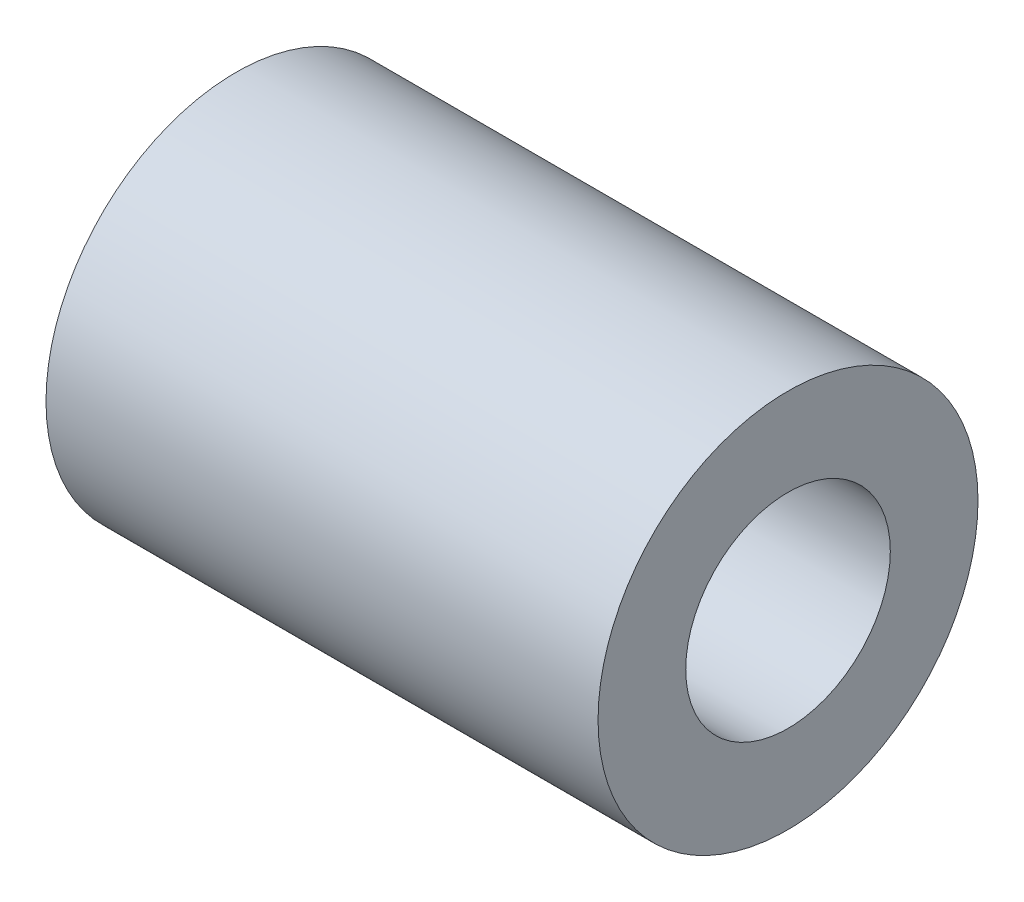
ISO-10303-21;
HEADER;
FILE_DESCRIPTION(('STEP AP214'),'2;1');
FILE_NAME('part.step','',(''),(''),'','','');
FILE_SCHEMA(('AUTOMOTIVE_DESIGN { 1 0 10303 214 1 1 1 1 }'));
ENDSEC;
DATA;
#1=APPLICATION_CONTEXT('core data for automotive mechanical design processes');
#2=APPLICATION_PROTOCOL_DEFINITION('international standard','automotive_design',2000,#1);
#3=PRODUCT_CONTEXT('',#1,'mechanical');
#4=PRODUCT('Part','Part','',(#3));
#5=PRODUCT_RELATED_PRODUCT_CATEGORY('part','',(#4));
#6=PRODUCT_DEFINITION_FORMATION('','',#4);
#7=PRODUCT_DEFINITION_CONTEXT('part definition',#1,'design');
#8=PRODUCT_DEFINITION('design','',#6,#7);
#9=PRODUCT_DEFINITION_SHAPE('','',#8);
#10=(LENGTH_UNIT() NAMED_UNIT(*) SI_UNIT(.MILLI.,.METRE.));
#11=(NAMED_UNIT(*) PLANE_ANGLE_UNIT() SI_UNIT($,.RADIAN.));
#12=(NAMED_UNIT(*) SI_UNIT($,.STERADIAN.) SOLID_ANGLE_UNIT());
#13=UNCERTAINTY_MEASURE_WITH_UNIT(LENGTH_MEASURE(1.E-05),#10,'distance_accuracy_value','');
#14=(GEOMETRIC_REPRESENTATION_CONTEXT(3) GLOBAL_UNCERTAINTY_ASSIGNED_CONTEXT((#13)) GLOBAL_UNIT_ASSIGNED_CONTEXT((#10,
#11,#12)) REPRESENTATION_CONTEXT('',''));
#15=CARTESIAN_POINT('',(0.,0.,0.));
#16=DIRECTION('',(0.,0.,1.));
#17=DIRECTION('',(1.,0.,0.));
#18=AXIS2_PLACEMENT_3D('',#15,#16,#17);
#19=CARTESIAN_POINT('',(17.,0.,0.));
#20=DIRECTION('',(1.,0.,0.));
#21=DIRECTION('',(0.,0.,-1.));
#22=AXIS2_PLACEMENT_3D('',#19,#20,#21);
#23=PLANE('',#22);
#24=CARTESIAN_POINT('',(17.,0.,0.));
#25=DIRECTION('',(1.,0.,0.));
#26=DIRECTION('',(0.,0.,-1.));
#27=AXIS2_PLACEMENT_3D('',#24,#25,#26);
#28=CIRCLE('',#27,5.85);
#29=CARTESIAN_POINT('',(17.,0.,-5.85));
#30=VERTEX_POINT('',#29);
#31=EDGE_CURVE('E10',#30,#30,#28,.T.);
#32=ORIENTED_EDGE('',*,*,#31,.T.);
#33=EDGE_LOOP('',(#32));
#34=FACE_BOUND('',#33,.T.);
#35=CARTESIAN_POINT('',(17.,0.,0.));
#36=DIRECTION('',(1.,0.,0.));
#37=DIRECTION('',(0.,0.,-1.));
#38=AXIS2_PLACEMENT_3D('',#35,#36,#37);
#39=CIRCLE('',#38,3.15);
#40=CARTESIAN_POINT('',(17.,0.,-3.15));
#41=VERTEX_POINT('',#40);
#42=EDGE_CURVE('E48',#41,#41,#39,.T.);
#43=ORIENTED_EDGE('',*,*,#42,.F.);
#44=EDGE_LOOP('',(#43));
#45=FACE_BOUND('',#44,.T.);
#46=ADVANCED_FACE('F37',(#34,#45),#23,.T.);
#47=CARTESIAN_POINT('',(0.,0.,0.));
#48=DIRECTION('',(1.,0.,0.));
#49=DIRECTION('',(0.,0.,-1.));
#50=AXIS2_PLACEMENT_3D('',#47,#48,#49);
#51=PLANE('',#50);
#52=CARTESIAN_POINT('',(0.,0.,0.));
#53=DIRECTION('',(1.,0.,0.));
#54=DIRECTION('',(0.,0.,-1.));
#55=AXIS2_PLACEMENT_3D('',#52,#53,#54);
#56=CIRCLE('',#55,5.85);
#57=CARTESIAN_POINT('',(0.,0.,-5.85));
#58=VERTEX_POINT('',#57);
#59=EDGE_CURVE('E41',#58,#58,#56,.T.);
#60=ORIENTED_EDGE('',*,*,#59,.F.);
#61=EDGE_LOOP('',(#60));
#62=FACE_BOUND('',#61,.T.);
#63=CARTESIAN_POINT('',(0.,0.,0.));
#64=DIRECTION('',(1.,0.,0.));
#65=DIRECTION('',(0.,0.,-1.));
#66=AXIS2_PLACEMENT_3D('',#63,#64,#65);
#67=CIRCLE('',#66,3.15);
#68=CARTESIAN_POINT('',(0.,0.,-3.15));
#69=VERTEX_POINT('',#68);
#70=EDGE_CURVE('E50',#69,#69,#67,.T.);
#71=ORIENTED_EDGE('',*,*,#70,.T.);
#72=EDGE_LOOP('',(#71));
#73=FACE_BOUND('',#72,.T.);
#74=ADVANCED_FACE('F60',(#62,#73),#51,.F.);
#75=CARTESIAN_POINT('',(17.,0.,0.));
#76=DIRECTION('',(-1.,0.,0.));
#77=DIRECTION('',(0.,0.,1.));
#78=AXIS2_PLACEMENT_3D('',#75,#76,#77);
#79=CYLINDRICAL_SURFACE('',#78,5.85);
#80=ORIENTED_EDGE('',*,*,#31,.F.);
#81=EDGE_LOOP('',(#80));
#82=FACE_BOUND('',#81,.T.);
#83=ORIENTED_EDGE('',*,*,#59,.T.);
#84=EDGE_LOOP('',(#83));
#85=FACE_BOUND('',#84,.T.);
#86=ADVANCED_FACE('F39',(#82,#85),#79,.T.);
#87=CARTESIAN_POINT('',(17.,0.,0.));
#88=DIRECTION('',(-1.,0.,0.));
#89=DIRECTION('',(0.,0.,1.));
#90=AXIS2_PLACEMENT_3D('',#87,#88,#89);
#91=CYLINDRICAL_SURFACE('',#90,3.15);
#92=ORIENTED_EDGE('',*,*,#42,.T.);
#93=EDGE_LOOP('',(#92));
#94=FACE_BOUND('',#93,.T.);
#95=ORIENTED_EDGE('',*,*,#70,.F.);
#96=EDGE_LOOP('',(#95));
#97=FACE_BOUND('',#96,.T.);
#98=ADVANCED_FACE('F56',(#94,#97),#91,.F.);
#99=CLOSED_SHELL('',(#46,#74,#86,#98));
#100=MANIFOLD_SOLID_BREP('B2',#99);
#101=ADVANCED_BREP_SHAPE_REPRESENTATION('',(#18,#100),#14);
#102=SHAPE_DEFINITION_REPRESENTATION(#9,#101);
ENDSEC;
END-ISO-10303-21;
